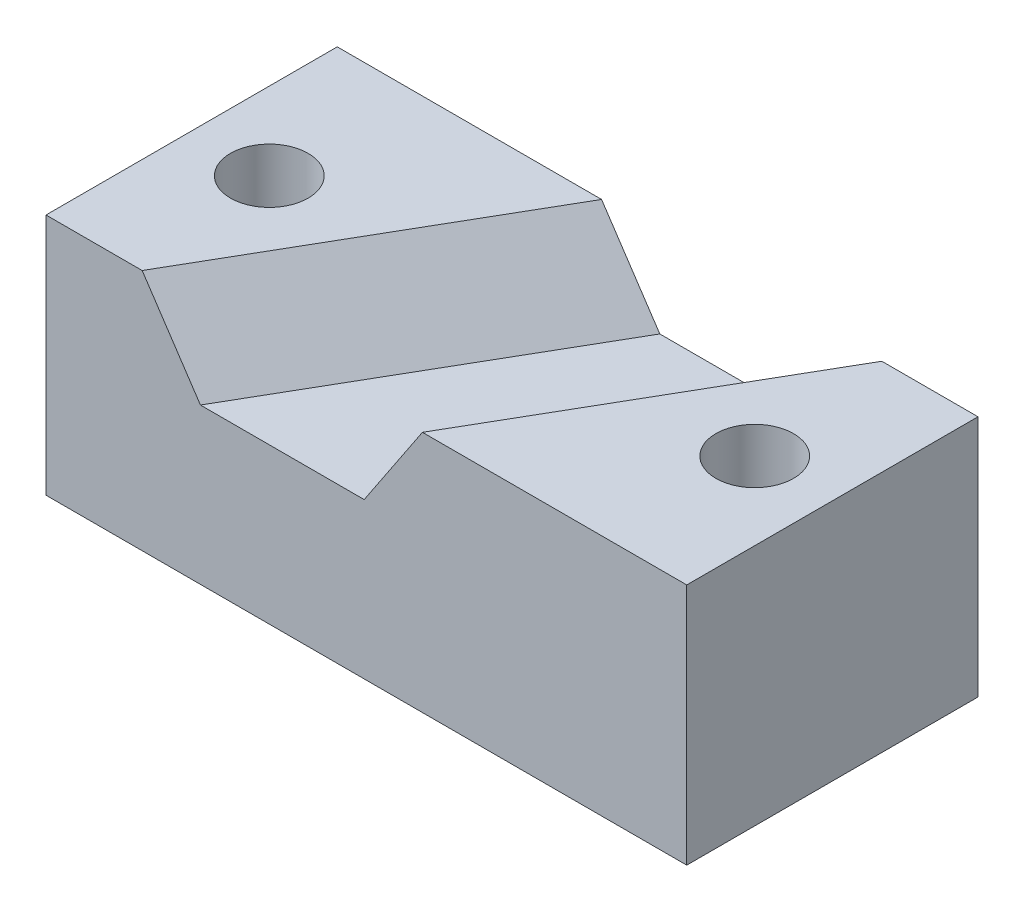
ISO-10303-21;
HEADER;
FILE_DESCRIPTION(('STEP AP214'),'2;1');
FILE_NAME('part.step','',(''),(''),'','','');
FILE_SCHEMA(('AUTOMOTIVE_DESIGN { 1 0 10303 214 1 1 1 1 }'));
ENDSEC;
DATA;
#1=APPLICATION_CONTEXT('core data for automotive mechanical design processes');
#2=APPLICATION_PROTOCOL_DEFINITION('international standard','automotive_design',2000,#1);
#3=PRODUCT_CONTEXT('',#1,'mechanical');
#4=PRODUCT('Part','Part','',(#3));
#5=PRODUCT_RELATED_PRODUCT_CATEGORY('part','',(#4));
#6=PRODUCT_DEFINITION_FORMATION('','',#4);
#7=PRODUCT_DEFINITION_CONTEXT('part definition',#1,'design');
#8=PRODUCT_DEFINITION('design','',#6,#7);
#9=PRODUCT_DEFINITION_SHAPE('','',#8);
#10=(LENGTH_UNIT() NAMED_UNIT(*) SI_UNIT(.MILLI.,.METRE.));
#11=(NAMED_UNIT(*) PLANE_ANGLE_UNIT() SI_UNIT($,.RADIAN.));
#12=(NAMED_UNIT(*) SI_UNIT($,.STERADIAN.) SOLID_ANGLE_UNIT());
#13=UNCERTAINTY_MEASURE_WITH_UNIT(LENGTH_MEASURE(1.E-05),#10,'distance_accuracy_value','');
#14=(GEOMETRIC_REPRESENTATION_CONTEXT(3) GLOBAL_UNCERTAINTY_ASSIGNED_CONTEXT((#13)) GLOBAL_UNIT_ASSIGNED_CONTEXT((#10,
#11,#12)) REPRESENTATION_CONTEXT('',''));
#15=CARTESIAN_POINT('',(0.,0.,0.));
#16=DIRECTION('',(0.,0.,1.));
#17=DIRECTION('',(1.,0.,0.));
#18=AXIS2_PLACEMENT_3D('',#15,#16,#17);
#19=CARTESIAN_POINT('',(0.,50.,0.));
#20=DIRECTION('',(0.,1.,0.));
#21=DIRECTION('',(0.,0.,1.));
#22=AXIS2_PLACEMENT_3D('',#19,#20,#21);
#23=PLANE('',#22);
#24=CARTESIAN_POINT('',(116.,50.,30.));
#25=DIRECTION('',(0.,1.,0.));
#26=DIRECTION('',(0.,0.,1.));
#27=AXIS2_PLACEMENT_3D('',#24,#25,#26);
#28=CIRCLE('',#27,8.);
#29=CARTESIAN_POINT('',(116.,50.,38.));
#30=VERTEX_POINT('',#29);
#31=EDGE_CURVE('E175',#30,#30,#28,.T.);
#32=ORIENTED_EDGE('',*,*,#31,.F.);
#33=EDGE_LOOP('',(#32));
#34=FACE_BOUND('',#33,.T.);
#35=DIRECTION('',(-1.,0.,0.));
#36=VECTOR('',#35,1.);
#37=CARTESIAN_POINT('',(0.,50.,0.));
#38=LINE('',#37,#36);
#39=CARTESIAN_POINT('',(132.,50.,0.));
#40=VERTEX_POINT('',#39);
#41=CARTESIAN_POINT('',(112.18802153517,50.,0.));
#42=VERTEX_POINT('',#41);
#43=EDGE_CURVE('E128',#40,#42,#38,.T.);
#44=ORIENTED_EDGE('',*,*,#43,.T.);
#45=DIRECTION('',(0.500000000000004,0.,-0.866025403784436));
#46=VECTOR('',#45,1.);
#47=CARTESIAN_POINT('',(84.1410161513773,50.,48.5788383248869));
#48=LINE('',#47,#46);
#49=CARTESIAN_POINT('',(77.5470053837924,50.,60.));
#50=VERTEX_POINT('',#49);
#51=EDGE_CURVE('E116',#42,#50,#48,.F.);
#52=ORIENTED_EDGE('',*,*,#51,.T.);
#53=DIRECTION('',(1.,0.,0.));
#54=VECTOR('',#53,1.);
#55=CARTESIAN_POINT('',(0.,50.,60.));
#56=LINE('',#55,#54);
#57=CARTESIAN_POINT('',(132.,50.,60.));
#58=VERTEX_POINT('',#57);
#59=EDGE_CURVE('E170',#50,#58,#56,.T.);
#60=ORIENTED_EDGE('',*,*,#59,.T.);
#61=DIRECTION('',(0.,0.,-1.));
#62=VECTOR('',#61,1.);
#63=CARTESIAN_POINT('',(132.,50.,0.));
#64=LINE('',#63,#62);
#65=EDGE_CURVE('E133',#58,#40,#64,.T.);
#66=ORIENTED_EDGE('',*,*,#65,.T.);
#67=EDGE_LOOP('',(#44,#52,#60,#66));
#68=FACE_BOUND('',#67,.T.);
#69=ADVANCED_FACE('F41',(#34,#68),#23,.T.);
#70=CARTESIAN_POINT('',(0.,50.,0.));
#71=DIRECTION('',(1.,0.,0.));
#72=DIRECTION('',(0.,0.,-1.));
#73=AXIS2_PLACEMENT_3D('',#70,#71,#72);
#74=PLANE('',#73);
#75=DIRECTION('',(0.,0.,1.));
#76=VECTOR('',#75,1.);
#77=CARTESIAN_POINT('',(0.,0.,0.));
#78=LINE('',#77,#76);
#79=CARTESIAN_POINT('',(0.,0.,0.));
#80=VERTEX_POINT('',#79);
#81=CARTESIAN_POINT('',(0.,0.,60.));
#82=VERTEX_POINT('',#81);
#83=EDGE_CURVE('E142',#80,#82,#78,.T.);
#84=ORIENTED_EDGE('',*,*,#83,.T.);
#85=DIRECTION('',(0.,-1.,0.));
#86=VECTOR('',#85,1.);
#87=CARTESIAN_POINT('',(0.,50.,60.));
#88=LINE('',#87,#86);
#89=CARTESIAN_POINT('',(0.,50.,60.));
#90=VERTEX_POINT('',#89);
#91=EDGE_CURVE('E124',#90,#82,#88,.T.);
#92=ORIENTED_EDGE('',*,*,#91,.F.);
#93=DIRECTION('',(0.,0.,1.));
#94=VECTOR('',#93,1.);
#95=CARTESIAN_POINT('',(0.,50.,0.));
#96=LINE('',#95,#94);
#97=CARTESIAN_POINT('',(0.,50.,0.));
#98=VERTEX_POINT('',#97);
#99=EDGE_CURVE('E150',#98,#90,#96,.T.);
#100=ORIENTED_EDGE('',*,*,#99,.F.);
#101=DIRECTION('',(0.,-1.,0.));
#102=VECTOR('',#101,1.);
#103=CARTESIAN_POINT('',(0.,50.,0.));
#104=LINE('',#103,#102);
#105=EDGE_CURVE('E135',#98,#80,#104,.T.);
#106=ORIENTED_EDGE('',*,*,#105,.T.);
#107=EDGE_LOOP('',(#84,#92,#100,#106));
#108=FACE_BOUND('',#107,.T.);
#109=ADVANCED_FACE('F43',(#108),#74,.F.);
#110=CARTESIAN_POINT('',(0.,50.,60.));
#111=DIRECTION('',(0.,0.,-1.));
#112=DIRECTION('',(-1.,0.,0.));
#113=AXIS2_PLACEMENT_3D('',#110,#111,#112);
#114=PLANE('',#113);
#115=DIRECTION('',(-1.,0.,0.));
#116=VECTOR('',#115,1.);
#117=CARTESIAN_POINT('',(0.,32.,60.));
#118=LINE('',#117,#116);
#119=CARTESIAN_POINT('',(65.5470053837924,32.,60.));
#120=VERTEX_POINT('',#119);
#121=CARTESIAN_POINT('',(31.8119784648297,32.,60.));
#122=VERTEX_POINT('',#121);
#123=EDGE_CURVE('E164',#120,#122,#118,.T.);
#124=ORIENTED_EDGE('',*,*,#123,.T.);
#125=DIRECTION('',(-0.554700196225231,0.832050294337842,0.));
#126=VECTOR('',#125,1.);
#127=CARTESIAN_POINT('',(13.7159850910359,59.1439900606906,60.));
#128=LINE('',#127,#126);
#129=CARTESIAN_POINT('',(19.8119784648296,50.,60.));
#130=VERTEX_POINT('',#129);
#131=EDGE_CURVE('E159',#122,#130,#128,.T.);
#132=ORIENTED_EDGE('',*,*,#131,.T.);
#133=EDGE_CURVE('E95',#90,#130,#56,.T.);
#134=ORIENTED_EDGE('',*,*,#133,.F.);
#135=ORIENTED_EDGE('',*,*,#91,.T.);
#136=DIRECTION('',(1.,0.,0.));
#137=VECTOR('',#136,1.);
#138=CARTESIAN_POINT('',(0.,0.,60.));
#139=LINE('',#138,#137);
#140=CARTESIAN_POINT('',(132.,0.,60.));
#141=VERTEX_POINT('',#140);
#142=EDGE_CURVE('E145',#82,#141,#139,.T.);
#143=ORIENTED_EDGE('',*,*,#142,.T.);
#144=DIRECTION('',(0.,-1.,0.));
#145=VECTOR('',#144,1.);
#146=CARTESIAN_POINT('',(132.,50.,60.));
#147=LINE('',#146,#145);
#148=EDGE_CURVE('E153',#58,#141,#147,.T.);
#149=ORIENTED_EDGE('',*,*,#148,.F.);
#150=ORIENTED_EDGE('',*,*,#59,.F.);
#151=DIRECTION('',(-0.554700196225231,-0.832050294337842,0.));
#152=VECTOR('',#151,1.);
#153=CARTESIAN_POINT('',(53.6863883426254,14.2090744382496,60.));
#154=LINE('',#153,#152);
#155=EDGE_CURVE('E56',#120,#50,#154,.F.);
#156=ORIENTED_EDGE('',*,*,#155,.F.);
#157=EDGE_LOOP('',(#124,#132,#134,#135,#143,#149,#150,#156));
#158=FACE_BOUND('',#157,.T.);
#159=ADVANCED_FACE('F163',(#158),#114,.F.);
#160=CARTESIAN_POINT('',(132.,50.,0.));
#161=DIRECTION('',(-1.,0.,0.));
#162=DIRECTION('',(0.,0.,1.));
#163=AXIS2_PLACEMENT_3D('',#160,#161,#162);
#164=PLANE('',#163);
#165=DIRECTION('',(0.,0.,-1.));
#166=VECTOR('',#165,1.);
#167=CARTESIAN_POINT('',(132.,0.,0.));
#168=LINE('',#167,#166);
#169=CARTESIAN_POINT('',(132.,0.,0.));
#170=VERTEX_POINT('',#169);
#171=EDGE_CURVE('E148',#141,#170,#168,.T.);
#172=ORIENTED_EDGE('',*,*,#171,.T.);
#173=DIRECTION('',(0.,-1.,0.));
#174=VECTOR('',#173,1.);
#175=CARTESIAN_POINT('',(132.,50.,0.));
#176=LINE('',#175,#174);
#177=EDGE_CURVE('E137',#40,#170,#176,.T.);
#178=ORIENTED_EDGE('',*,*,#177,.F.);
#179=ORIENTED_EDGE('',*,*,#65,.F.);
#180=ORIENTED_EDGE('',*,*,#148,.T.);
#181=EDGE_LOOP('',(#172,#178,#179,#180));
#182=FACE_BOUND('',#181,.T.);
#183=ADVANCED_FACE('F197',(#182),#164,.F.);
#184=CARTESIAN_POINT('',(0.,50.,0.));
#185=DIRECTION('',(0.,0.,1.));
#186=DIRECTION('',(1.,0.,0.));
#187=AXIS2_PLACEMENT_3D('',#184,#185,#186);
#188=PLANE('',#187);
#189=CARTESIAN_POINT('',(54.4529946162076,50.,0.));
#190=VERTEX_POINT('',#189);
#191=EDGE_CURVE('E65',#190,#98,#38,.T.);
#192=ORIENTED_EDGE('',*,*,#191,.F.);
#193=DIRECTION('',(0.554700196225231,-0.832050294337842,0.));
#194=VECTOR('',#193,1.);
#195=CARTESIAN_POINT('',(37.6982270419897,75.1321513613266,0.));
#196=LINE('',#195,#194);
#197=CARTESIAN_POINT('',(66.4529946162076,32.,0.));
#198=VERTEX_POINT('',#197);
#199=EDGE_CURVE('E161',#190,#198,#196,.T.);
#200=ORIENTED_EDGE('',*,*,#199,.T.);
#201=DIRECTION('',(1.,0.,0.));
#202=VECTOR('',#201,1.);
#203=CARTESIAN_POINT('',(0.,32.,0.));
#204=LINE('',#203,#202);
#205=CARTESIAN_POINT('',(100.18802153517,32.,0.));
#206=VERTEX_POINT('',#205);
#207=EDGE_CURVE('E11',#198,#206,#204,.T.);
#208=ORIENTED_EDGE('',*,*,#207,.T.);
#209=DIRECTION('',(0.554700196225231,0.832050294337842,0.));
#210=VECTOR('',#209,1.);
#211=CARTESIAN_POINT('',(77.6686302935792,-1.77908686238641,0.));
#212=LINE('',#211,#210);
#213=EDGE_CURVE('E119',#42,#206,#212,.F.);
#214=ORIENTED_EDGE('',*,*,#213,.F.);
#215=ORIENTED_EDGE('',*,*,#43,.F.);
#216=ORIENTED_EDGE('',*,*,#177,.T.);
#217=DIRECTION('',(-1.,0.,0.));
#218=VECTOR('',#217,1.);
#219=CARTESIAN_POINT('',(0.,0.,0.));
#220=LINE('',#219,#218);
#221=EDGE_CURVE('E87',#170,#80,#220,.T.);
#222=ORIENTED_EDGE('',*,*,#221,.T.);
#223=ORIENTED_EDGE('',*,*,#105,.F.);
#224=EDGE_LOOP('',(#192,#200,#208,#214,#215,#216,#222,#223));
#225=FACE_BOUND('',#224,.T.);
#226=ADVANCED_FACE('F127',(#225),#188,.F.);
#227=DIRECTION('',(-0.500000000000004,0.,0.866025403784436));
#228=VECTOR('',#227,1.);
#229=CARTESIAN_POINT('',(40.8397459621555,50.,23.5788383248866));
#230=LINE('',#229,#228);
#231=EDGE_CURVE('E49',#190,#130,#230,.T.);
#232=ORIENTED_EDGE('',*,*,#231,.F.);
#233=ORIENTED_EDGE('',*,*,#191,.T.);
#234=ORIENTED_EDGE('',*,*,#99,.T.);
#235=ORIENTED_EDGE('',*,*,#133,.T.);
#236=EDGE_LOOP('',(#232,#233,#234,#235));
#237=FACE_BOUND('',#236,.T.);
#238=CARTESIAN_POINT('',(16.,50.,30.));
#239=DIRECTION('',(0.,1.,0.));
#240=DIRECTION('',(0.,0.,1.));
#241=AXIS2_PLACEMENT_3D('',#238,#239,#240);
#242=CIRCLE('',#241,8.);
#243=CARTESIAN_POINT('',(16.,50.,38.));
#244=VERTEX_POINT('',#243);
#245=EDGE_CURVE('E146',#244,#244,#242,.T.);
#246=ORIENTED_EDGE('',*,*,#245,.F.);
#247=EDGE_LOOP('',(#246));
#248=FACE_BOUND('',#247,.T.);
#249=ADVANCED_FACE('F166',(#237,#248),#23,.T.);
#250=CARTESIAN_POINT('',(0.,0.,0.));
#251=DIRECTION('',(0.,1.,0.));
#252=DIRECTION('',(0.,0.,1.));
#253=AXIS2_PLACEMENT_3D('',#250,#251,#252);
#254=PLANE('',#253);
#255=CARTESIAN_POINT('',(16.,0.,30.));
#256=DIRECTION('',(0.,1.,0.));
#257=DIRECTION('',(0.,0.,1.));
#258=AXIS2_PLACEMENT_3D('',#255,#256,#257);
#259=CIRCLE('',#258,8.);
#260=CARTESIAN_POINT('',(16.,0.,38.));
#261=VERTEX_POINT('',#260);
#262=EDGE_CURVE('E178',#261,#261,#259,.T.);
#263=ORIENTED_EDGE('',*,*,#262,.T.);
#264=EDGE_LOOP('',(#263));
#265=FACE_BOUND('',#264,.T.);
#266=CARTESIAN_POINT('',(116.,0.,30.));
#267=DIRECTION('',(0.,1.,0.));
#268=DIRECTION('',(0.,0.,-1.));
#269=AXIS2_PLACEMENT_3D('',#266,#267,#268);
#270=CIRCLE('',#269,8.);
#271=CARTESIAN_POINT('',(116.,0.,22.));
#272=VERTEX_POINT('',#271);
#273=EDGE_CURVE('E179',#272,#272,#270,.T.);
#274=ORIENTED_EDGE('',*,*,#273,.T.);
#275=EDGE_LOOP('',(#274));
#276=FACE_BOUND('',#275,.T.);
#277=ORIENTED_EDGE('',*,*,#83,.F.);
#278=ORIENTED_EDGE('',*,*,#221,.F.);
#279=ORIENTED_EDGE('',*,*,#171,.F.);
#280=ORIENTED_EDGE('',*,*,#142,.F.);
#281=EDGE_LOOP('',(#277,#278,#279,#280));
#282=FACE_BOUND('',#281,.T.);
#283=ADVANCED_FACE('F198',(#265,#276,#282),#254,.F.);
#284=CARTESIAN_POINT('',(116.,0.,30.));
#285=DIRECTION('',(0.,1.,0.));
#286=DIRECTION('',(0.,0.,1.));
#287=AXIS2_PLACEMENT_3D('',#284,#285,#286);
#288=CYLINDRICAL_SURFACE('',#287,8.);
#289=ORIENTED_EDGE('',*,*,#31,.T.);
#290=EDGE_LOOP('',(#289));
#291=FACE_BOUND('',#290,.T.);
#292=ORIENTED_EDGE('',*,*,#273,.F.);
#293=EDGE_LOOP('',(#292));
#294=FACE_BOUND('',#293,.T.);
#295=ADVANCED_FACE('F200',(#291,#294),#288,.F.);
#296=CARTESIAN_POINT('',(16.,0.,30.));
#297=DIRECTION('',(0.,1.,0.));
#298=DIRECTION('',(0.,0.,1.));
#299=AXIS2_PLACEMENT_3D('',#296,#297,#298);
#300=CYLINDRICAL_SURFACE('',#299,8.);
#301=ORIENTED_EDGE('',*,*,#245,.T.);
#302=EDGE_LOOP('',(#301));
#303=FACE_BOUND('',#302,.T.);
#304=ORIENTED_EDGE('',*,*,#262,.F.);
#305=EDGE_LOOP('',(#304));
#306=FACE_BOUND('',#305,.T.);
#307=ADVANCED_FACE('F207',(#303,#306),#300,.F.);
#308=CARTESIAN_POINT('',(0.,32.,0.));
#309=DIRECTION('',(0.,-1.,0.));
#310=DIRECTION('',(-1.,0.,0.));
#311=AXIS2_PLACEMENT_3D('',#308,#309,#310);
#312=PLANE('',#311);
#313=DIRECTION('',(0.500000000000004,0.,-0.866025403784436));
#314=VECTOR('',#313,1.);
#315=CARTESIAN_POINT('',(110.447201725104,32.,-17.769421332969));
#316=LINE('',#315,#314);
#317=EDGE_CURVE('E130',#206,#120,#316,.F.);
#318=ORIENTED_EDGE('',*,*,#317,.F.);
#319=ORIENTED_EDGE('',*,*,#207,.F.);
#320=DIRECTION('',(-0.500000000000004,0.,0.866025403784436));
#321=VECTOR('',#320,1.);
#322=CARTESIAN_POINT('',(85.1459315358821,32.,-32.3771164875558));
#323=LINE('',#322,#321);
#324=EDGE_CURVE('E188',#198,#122,#323,.T.);
#325=ORIENTED_EDGE('',*,*,#324,.T.);
#326=ORIENTED_EDGE('',*,*,#123,.F.);
#327=EDGE_LOOP('',(#318,#319,#325,#326));
#328=FACE_BOUND('',#327,.T.);
#329=ADVANCED_FACE('F190',(#328),#312,.F.);
#330=CARTESIAN_POINT('',(76.1459315358821,50.,-37.5732689102625));
#331=DIRECTION('',(-0.749999999999998,-0.500000000000001,-0.433012701892223));
#332=DIRECTION('',(0.554700196225231,-0.832050294337842,0.));
#333=AXIS2_PLACEMENT_3D('',#330,#331,#332);
#334=PLANE('',#333);
#335=ORIENTED_EDGE('',*,*,#324,.F.);
#336=ORIENTED_EDGE('',*,*,#199,.F.);
#337=ORIENTED_EDGE('',*,*,#231,.T.);
#338=ORIENTED_EDGE('',*,*,#131,.F.);
#339=EDGE_LOOP('',(#335,#336,#337,#338));
#340=FACE_BOUND('',#339,.T.);
#341=ADVANCED_FACE('F158',(#340),#334,.F.);
#342=CARTESIAN_POINT('',(119.447201725104,50.,-12.5732689102623));
#343=DIRECTION('',(0.749999999999998,-0.500000000000001,0.433012701892223));
#344=DIRECTION('',(0.554700196225231,0.832050294337842,0.));
#345=AXIS2_PLACEMENT_3D('',#342,#343,#344);
#346=PLANE('',#345);
#347=ORIENTED_EDGE('',*,*,#155,.T.);
#348=ORIENTED_EDGE('',*,*,#51,.F.);
#349=ORIENTED_EDGE('',*,*,#213,.T.);
#350=ORIENTED_EDGE('',*,*,#317,.T.);
#351=EDGE_LOOP('',(#347,#348,#349,#350));
#352=FACE_BOUND('',#351,.T.);
#353=ADVANCED_FACE('F118',(#352),#346,.F.);
#354=CLOSED_SHELL('',(#69,#109,#159,#183,#226,#249,#283,#295,#307,#329,#341,#353));
#355=MANIFOLD_SOLID_BREP('B2',#354);
#356=ADVANCED_BREP_SHAPE_REPRESENTATION('',(#18,#355),#14);
#357=SHAPE_DEFINITION_REPRESENTATION(#9,#356);
ENDSEC;
END-ISO-10303-21;
